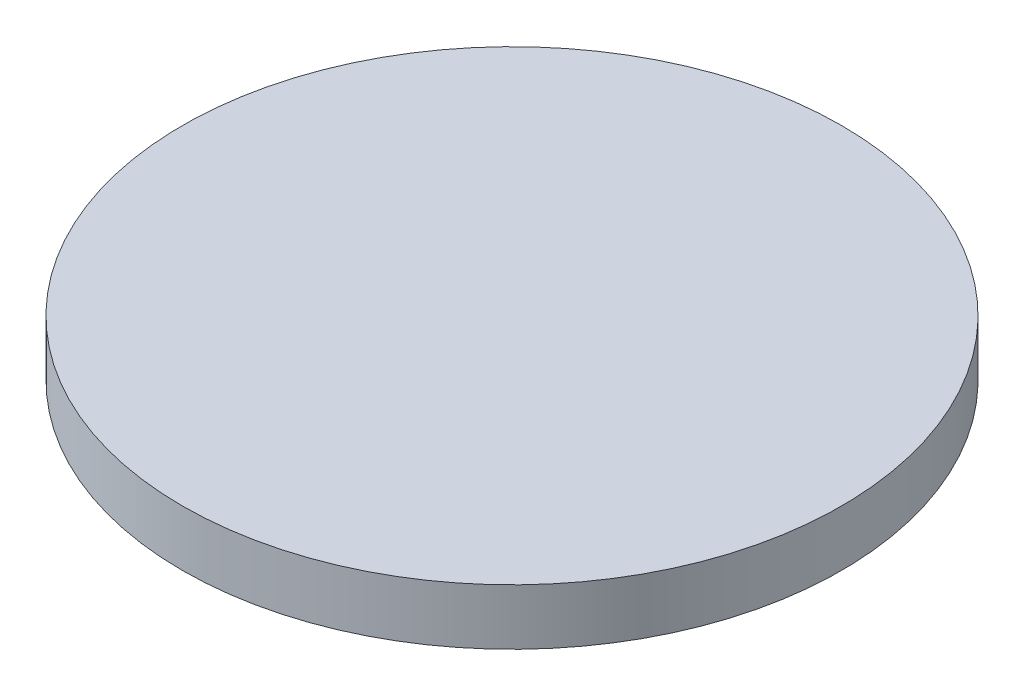
ISO-10303-21;
HEADER;
FILE_DESCRIPTION(('STEP AP214'),'2;1');
FILE_NAME('part.step','',(''),(''),'','','');
FILE_SCHEMA(('AUTOMOTIVE_DESIGN { 1 0 10303 214 1 1 1 1 }'));
ENDSEC;
DATA;
#1=APPLICATION_CONTEXT('core data for automotive mechanical design processes');
#2=APPLICATION_PROTOCOL_DEFINITION('international standard','automotive_design',2000,#1);
#3=PRODUCT_CONTEXT('',#1,'mechanical');
#4=PRODUCT('Part','Part','',(#3));
#5=PRODUCT_RELATED_PRODUCT_CATEGORY('part','',(#4));
#6=PRODUCT_DEFINITION_FORMATION('','',#4);
#7=PRODUCT_DEFINITION_CONTEXT('part definition',#1,'design');
#8=PRODUCT_DEFINITION('design','',#6,#7);
#9=PRODUCT_DEFINITION_SHAPE('','',#8);
#10=(LENGTH_UNIT() NAMED_UNIT(*) SI_UNIT(.MILLI.,.METRE.));
#11=(NAMED_UNIT(*) PLANE_ANGLE_UNIT() SI_UNIT($,.RADIAN.));
#12=(NAMED_UNIT(*) SI_UNIT($,.STERADIAN.) SOLID_ANGLE_UNIT());
#13=UNCERTAINTY_MEASURE_WITH_UNIT(LENGTH_MEASURE(1.E-05),#10,'distance_accuracy_value','');
#14=(GEOMETRIC_REPRESENTATION_CONTEXT(3) GLOBAL_UNCERTAINTY_ASSIGNED_CONTEXT((#13)) GLOBAL_UNIT_ASSIGNED_CONTEXT((#10,
#11,#12)) REPRESENTATION_CONTEXT('',''));
#15=CARTESIAN_POINT('',(0.,0.,0.));
#16=DIRECTION('',(0.,0.,1.));
#17=DIRECTION('',(1.,0.,0.));
#18=AXIS2_PLACEMENT_3D('',#15,#16,#17);
#19=CARTESIAN_POINT('',(0.,6.35,0.));
#20=DIRECTION('',(0.,-1.,0.));
#21=DIRECTION('',(0.,0.,-1.));
#22=AXIS2_PLACEMENT_3D('',#19,#20,#21);
#23=CYLINDRICAL_SURFACE('',#22,37.465);
#24=CARTESIAN_POINT('',(0.,6.35,0.));
#25=DIRECTION('',(0.,1.,0.));
#26=DIRECTION('',(0.,0.,1.));
#27=AXIS2_PLACEMENT_3D('',#24,#25,#26);
#28=CIRCLE('',#27,37.465);
#29=CARTESIAN_POINT('',(0.,6.35,37.465));
#30=VERTEX_POINT('',#29);
#31=EDGE_CURVE('E10',#30,#30,#28,.T.);
#32=ORIENTED_EDGE('',*,*,#31,.F.);
#33=EDGE_LOOP('',(#32));
#34=FACE_BOUND('',#33,.T.);
#35=CARTESIAN_POINT('',(0.,0.,0.));
#36=DIRECTION('',(0.,1.,0.));
#37=DIRECTION('',(0.,0.,1.));
#38=AXIS2_PLACEMENT_3D('',#35,#36,#37);
#39=CIRCLE('',#38,37.465);
#40=CARTESIAN_POINT('',(0.,0.,37.465));
#41=VERTEX_POINT('',#40);
#42=EDGE_CURVE('E38',#41,#41,#39,.T.);
#43=ORIENTED_EDGE('',*,*,#42,.T.);
#44=EDGE_LOOP('',(#43));
#45=FACE_BOUND('',#44,.T.);
#46=ADVANCED_FACE('F35',(#34,#45),#23,.T.);
#47=CARTESIAN_POINT('',(0.,6.35,0.));
#48=DIRECTION('',(0.,1.,0.));
#49=DIRECTION('',(0.,0.,1.));
#50=AXIS2_PLACEMENT_3D('',#47,#48,#49);
#51=PLANE('',#50);
#52=ORIENTED_EDGE('',*,*,#31,.T.);
#53=EDGE_LOOP('',(#52));
#54=FACE_BOUND('',#53,.T.);
#55=ADVANCED_FACE('F50',(#54),#51,.T.);
#56=CARTESIAN_POINT('',(0.,0.,0.));
#57=DIRECTION('',(0.,1.,0.));
#58=DIRECTION('',(0.,0.,1.));
#59=AXIS2_PLACEMENT_3D('',#56,#57,#58);
#60=PLANE('',#59);
#61=ORIENTED_EDGE('',*,*,#42,.F.);
#62=EDGE_LOOP('',(#61));
#63=FACE_BOUND('',#62,.T.);
#64=ADVANCED_FACE('F48',(#63),#60,.F.);
#65=CLOSED_SHELL('',(#46,#55,#64));
#66=MANIFOLD_SOLID_BREP('B2',#65);
#67=ADVANCED_BREP_SHAPE_REPRESENTATION('',(#18,#66),#14);
#68=SHAPE_DEFINITION_REPRESENTATION(#9,#67);
ENDSEC;
END-ISO-10303-21;
